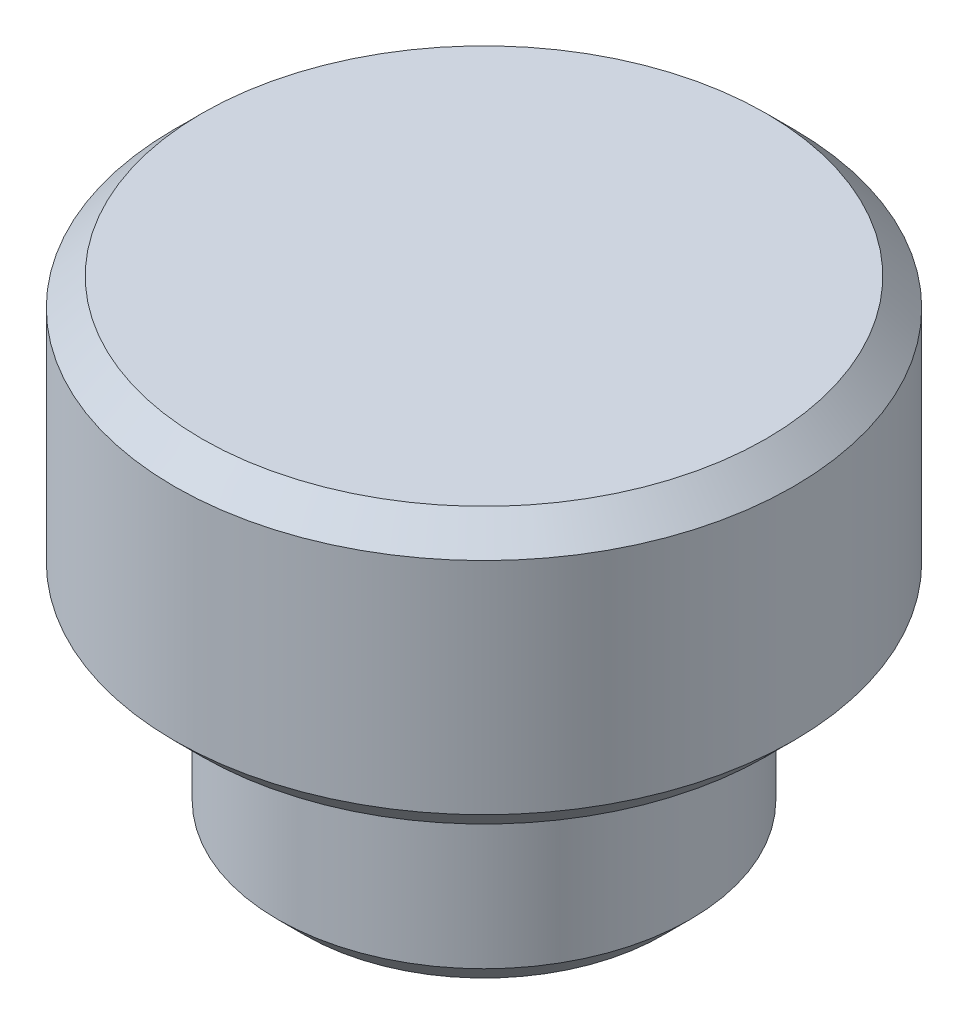
ISO-10303-21;
HEADER;
FILE_DESCRIPTION(('STEP AP214'),'2;1');
FILE_NAME('part.step','',(''),(''),'','','');
FILE_SCHEMA(('AUTOMOTIVE_DESIGN { 1 0 10303 214 1 1 1 1 }'));
ENDSEC;
DATA;
#1=APPLICATION_CONTEXT('core data for automotive mechanical design processes');
#2=APPLICATION_PROTOCOL_DEFINITION('international standard','automotive_design',2000,#1);
#3=PRODUCT_CONTEXT('',#1,'mechanical');
#4=PRODUCT('Part','Part','',(#3));
#5=PRODUCT_RELATED_PRODUCT_CATEGORY('part','',(#4));
#6=PRODUCT_DEFINITION_FORMATION('','',#4);
#7=PRODUCT_DEFINITION_CONTEXT('part definition',#1,'design');
#8=PRODUCT_DEFINITION('design','',#6,#7);
#9=PRODUCT_DEFINITION_SHAPE('','',#8);
#10=(LENGTH_UNIT() NAMED_UNIT(*) SI_UNIT(.MILLI.,.METRE.));
#11=(NAMED_UNIT(*) PLANE_ANGLE_UNIT() SI_UNIT($,.RADIAN.));
#12=(NAMED_UNIT(*) SI_UNIT($,.STERADIAN.) SOLID_ANGLE_UNIT());
#13=UNCERTAINTY_MEASURE_WITH_UNIT(LENGTH_MEASURE(1.E-05),#10,'distance_accuracy_value','');
#14=(GEOMETRIC_REPRESENTATION_CONTEXT(3) GLOBAL_UNCERTAINTY_ASSIGNED_CONTEXT((#13)) GLOBAL_UNIT_ASSIGNED_CONTEXT((#10,
#11,#12)) REPRESENTATION_CONTEXT('',''));
#15=CARTESIAN_POINT('',(0.,0.,0.));
#16=DIRECTION('',(0.,0.,1.));
#17=DIRECTION('',(1.,0.,0.));
#18=AXIS2_PLACEMENT_3D('',#15,#16,#17);
#19=CARTESIAN_POINT('',(0.,3.,0.));
#20=DIRECTION('',(0.,-1.,0.));
#21=DIRECTION('',(0.,0.,-1.));
#22=AXIS2_PLACEMENT_3D('',#19,#20,#21);
#23=CYLINDRICAL_SURFACE('',#22,3.);
#24=CARTESIAN_POINT('',(0.,2.6,0.));
#25=DIRECTION('',(0.,1.,0.));
#26=DIRECTION('',(0.,0.,1.));
#27=AXIS2_PLACEMENT_3D('',#24,#25,#26);
#28=CIRCLE('',#27,3.);
#29=CARTESIAN_POINT('',(0.,2.6,3.));
#30=VERTEX_POINT('',#29);
#31=EDGE_CURVE('E47',#30,#30,#28,.F.);
#32=ORIENTED_EDGE('',*,*,#31,.T.);
#33=EDGE_LOOP('',(#32));
#34=FACE_BOUND('',#33,.T.);
#35=CARTESIAN_POINT('',(0.,0.399999999999998,0.));
#36=DIRECTION('',(0.,1.,0.));
#37=DIRECTION('',(0.,0.,1.));
#38=AXIS2_PLACEMENT_3D('',#35,#36,#37);
#39=CIRCLE('',#38,3.);
#40=CARTESIAN_POINT('',(0.,0.399999999999998,3.));
#41=VERTEX_POINT('',#40);
#42=EDGE_CURVE('E51',#41,#41,#39,.T.);
#43=ORIENTED_EDGE('',*,*,#42,.T.);
#44=EDGE_LOOP('',(#43));
#45=FACE_BOUND('',#44,.T.);
#46=ADVANCED_FACE('F35',(#34,#45),#23,.T.);
#47=CARTESIAN_POINT('',(0.,0.,0.));
#48=DIRECTION('',(0.,1.,0.));
#49=DIRECTION('',(0.,0.,1.));
#50=AXIS2_PLACEMENT_3D('',#47,#48,#49);
#51=PLANE('',#50);
#52=CARTESIAN_POINT('',(0.,0.,0.));
#53=DIRECTION('',(0.,1.,0.));
#54=DIRECTION('',(0.,0.,1.));
#55=AXIS2_PLACEMENT_3D('',#52,#53,#54);
#56=CIRCLE('',#55,2.6);
#57=CARTESIAN_POINT('',(0.,0.,2.6));
#58=VERTEX_POINT('',#57);
#59=EDGE_CURVE('E43',#58,#58,#56,.F.);
#60=ORIENTED_EDGE('',*,*,#59,.T.);
#61=EDGE_LOOP('',(#60));
#62=FACE_BOUND('',#61,.T.);
#63=ADVANCED_FACE('F80',(#62),#51,.F.);
#64=CARTESIAN_POINT('',(0.,7.,0.));
#65=DIRECTION('',(0.,-1.,0.));
#66=DIRECTION('',(0.,0.,-1.));
#67=AXIS2_PLACEMENT_3D('',#64,#65,#66);
#68=CYLINDRICAL_SURFACE('',#67,4.5);
#69=CARTESIAN_POINT('',(0.,3.4,0.));
#70=DIRECTION('',(0.,1.,0.));
#71=DIRECTION('',(0.,0.,1.));
#72=AXIS2_PLACEMENT_3D('',#69,#70,#71);
#73=CIRCLE('',#72,4.5);
#74=CARTESIAN_POINT('',(0.,3.4,4.5));
#75=VERTEX_POINT('',#74);
#76=EDGE_CURVE('E62',#75,#75,#73,.T.);
#77=ORIENTED_EDGE('',*,*,#76,.T.);
#78=EDGE_LOOP('',(#77));
#79=FACE_BOUND('',#78,.T.);
#80=CARTESIAN_POINT('',(0.,6.6,0.));
#81=DIRECTION('',(0.,1.,0.));
#82=DIRECTION('',(0.,0.,1.));
#83=AXIS2_PLACEMENT_3D('',#80,#81,#82);
#84=CIRCLE('',#83,4.5);
#85=CARTESIAN_POINT('',(0.,6.6,4.5));
#86=VERTEX_POINT('',#85);
#87=EDGE_CURVE('E65',#86,#86,#84,.F.);
#88=ORIENTED_EDGE('',*,*,#87,.T.);
#89=EDGE_LOOP('',(#88));
#90=FACE_BOUND('',#89,.T.);
#91=ADVANCED_FACE('F69',(#79,#90),#68,.T.);
#92=CARTESIAN_POINT('',(0.,7.,0.));
#93=DIRECTION('',(0.,1.,0.));
#94=DIRECTION('',(0.,0.,1.));
#95=AXIS2_PLACEMENT_3D('',#92,#93,#94);
#96=PLANE('',#95);
#97=CARTESIAN_POINT('',(0.,7.,0.));
#98=DIRECTION('',(0.,1.,0.));
#99=DIRECTION('',(0.,0.,1.));
#100=AXIS2_PLACEMENT_3D('',#97,#98,#99);
#101=CIRCLE('',#100,4.1);
#102=CARTESIAN_POINT('',(0.,7.,4.1));
#103=VERTEX_POINT('',#102);
#104=EDGE_CURVE('E10',#103,#103,#101,.T.);
#105=ORIENTED_EDGE('',*,*,#104,.T.);
#106=EDGE_LOOP('',(#105));
#107=FACE_BOUND('',#106,.T.);
#108=ADVANCED_FACE('F115',(#107),#96,.T.);
#109=CARTESIAN_POINT('',(0.,3.,0.));
#110=DIRECTION('',(0.,1.,0.));
#111=DIRECTION('',(0.,0.,1.));
#112=AXIS2_PLACEMENT_3D('',#109,#110,#111);
#113=PLANE('',#112);
#114=CARTESIAN_POINT('',(0.,3.,0.));
#115=DIRECTION('',(0.,1.,0.));
#116=DIRECTION('',(0.,0.,1.));
#117=AXIS2_PLACEMENT_3D('',#114,#115,#116);
#118=CIRCLE('',#117,4.1);
#119=CARTESIAN_POINT('',(0.,3.,4.1));
#120=VERTEX_POINT('',#119);
#121=EDGE_CURVE('E56',#120,#120,#118,.F.);
#122=ORIENTED_EDGE('',*,*,#121,.T.);
#123=EDGE_LOOP('',(#122));
#124=FACE_BOUND('',#123,.T.);
#125=CARTESIAN_POINT('',(0.,3.,0.));
#126=DIRECTION('',(0.,1.,0.));
#127=DIRECTION('',(0.,0.,1.));
#128=AXIS2_PLACEMENT_3D('',#125,#126,#127);
#129=CIRCLE('',#128,3.4);
#130=CARTESIAN_POINT('',(0.,3.,3.4));
#131=VERTEX_POINT('',#130);
#132=EDGE_CURVE('E59',#131,#131,#129,.T.);
#133=ORIENTED_EDGE('',*,*,#132,.T.);
#134=EDGE_LOOP('',(#133));
#135=FACE_BOUND('',#134,.T.);
#136=ADVANCED_FACE('F97',(#124,#135),#113,.F.);
#137=CARTESIAN_POINT('',(0.,3.4,0.));
#138=DIRECTION('',(0.,1.,0.));
#139=DIRECTION('',(0.,0.,1.));
#140=AXIS2_PLACEMENT_3D('',#137,#138,#139);
#141=CONICAL_SURFACE('',#140,4.5,0.785398163397449);
#142=CARTESIAN_POINT('',(0.,3.,4.1));
#143=CARTESIAN_POINT('',(0.,3.00416666666667,4.10416666666667));
#144=CARTESIAN_POINT('',(0.,3.00833333333333,4.10833333333333));
#145=CARTESIAN_POINT('',(0.,3.01666666666667,4.11666666666667));
#146=CARTESIAN_POINT('',(0.,3.02083333333333,4.12083333333333));
#147=CARTESIAN_POINT('',(0.,3.02916666666667,4.12916666666667));
#148=CARTESIAN_POINT('',(0.,3.03333333333333,4.13333333333333));
#149=CARTESIAN_POINT('',(0.,3.04166666666667,4.14166666666667));
#150=CARTESIAN_POINT('',(0.,3.04583333333333,4.14583333333333));
#151=CARTESIAN_POINT('',(0.,3.05416666666667,4.15416666666667));
#152=CARTESIAN_POINT('',(0.,3.05833333333333,4.15833333333333));
#153=CARTESIAN_POINT('',(0.,3.06666666666667,4.16666666666667));
#154=CARTESIAN_POINT('',(0.,3.07083333333333,4.17083333333333));
#155=CARTESIAN_POINT('',(0.,3.07916666666667,4.17916666666667));
#156=CARTESIAN_POINT('',(0.,3.08333333333333,4.18333333333333));
#157=CARTESIAN_POINT('',(0.,3.09166666666667,4.19166666666667));
#158=CARTESIAN_POINT('',(0.,3.09583333333333,4.19583333333333));
#159=CARTESIAN_POINT('',(0.,3.10416666666667,4.20416666666667));
#160=CARTESIAN_POINT('',(0.,3.10833333333333,4.20833333333333));
#161=CARTESIAN_POINT('',(0.,3.11666666666667,4.21666666666667));
#162=CARTESIAN_POINT('',(0.,3.12083333333333,4.22083333333333));
#163=CARTESIAN_POINT('',(0.,3.12916666666667,4.22916666666667));
#164=CARTESIAN_POINT('',(0.,3.13333333333333,4.23333333333333));
#165=CARTESIAN_POINT('',(0.,3.14166666666667,4.24166666666667));
#166=CARTESIAN_POINT('',(0.,3.14583333333333,4.24583333333333));
#167=CARTESIAN_POINT('',(0.,3.15416666666667,4.25416666666667));
#168=CARTESIAN_POINT('',(0.,3.15833333333333,4.25833333333333));
#169=CARTESIAN_POINT('',(0.,3.16666666666667,4.26666666666667));
#170=CARTESIAN_POINT('',(0.,3.17083333333333,4.27083333333333));
#171=CARTESIAN_POINT('',(0.,3.17916666666667,4.27916666666667));
#172=CARTESIAN_POINT('',(0.,3.18333333333333,4.28333333333333));
#173=CARTESIAN_POINT('',(0.,3.19166666666667,4.29166666666667));
#174=CARTESIAN_POINT('',(0.,3.19583333333333,4.29583333333333));
#175=CARTESIAN_POINT('',(0.,3.20416666666667,4.30416666666667));
#176=CARTESIAN_POINT('',(0.,3.20833333333333,4.30833333333333));
#177=CARTESIAN_POINT('',(0.,3.21666666666667,4.31666666666667));
#178=CARTESIAN_POINT('',(0.,3.22083333333333,4.32083333333333));
#179=CARTESIAN_POINT('',(0.,3.22916666666667,4.32916666666667));
#180=CARTESIAN_POINT('',(0.,3.23333333333333,4.33333333333333));
#181=CARTESIAN_POINT('',(0.,3.24166666666667,4.34166666666667));
#182=CARTESIAN_POINT('',(0.,3.24583333333333,4.34583333333333));
#183=CARTESIAN_POINT('',(0.,3.25416666666667,4.35416666666667));
#184=CARTESIAN_POINT('',(0.,3.25833333333333,4.35833333333333));
#185=CARTESIAN_POINT('',(0.,3.26666666666667,4.36666666666667));
#186=CARTESIAN_POINT('',(0.,3.27083333333333,4.37083333333333));
#187=CARTESIAN_POINT('',(0.,3.27916666666667,4.37916666666667));
#188=CARTESIAN_POINT('',(0.,3.28333333333333,4.38333333333333));
#189=CARTESIAN_POINT('',(0.,3.29166666666667,4.39166666666667));
#190=CARTESIAN_POINT('',(0.,3.29583333333333,4.39583333333333));
#191=CARTESIAN_POINT('',(0.,3.30416666666667,4.40416666666667));
#192=CARTESIAN_POINT('',(0.,3.30833333333333,4.40833333333333));
#193=CARTESIAN_POINT('',(0.,3.31666666666667,4.41666666666667));
#194=CARTESIAN_POINT('',(0.,3.32083333333333,4.42083333333333));
#195=CARTESIAN_POINT('',(0.,3.32916666666667,4.42916666666667));
#196=CARTESIAN_POINT('',(0.,3.33333333333333,4.43333333333333));
#197=CARTESIAN_POINT('',(0.,3.34166666666667,4.44166666666667));
#198=CARTESIAN_POINT('',(0.,3.34583333333333,4.44583333333333));
#199=CARTESIAN_POINT('',(0.,3.35416666666667,4.45416666666667));
#200=CARTESIAN_POINT('',(0.,3.35833333333333,4.45833333333333));
#201=CARTESIAN_POINT('',(0.,3.36666666666666,4.46666666666667));
#202=CARTESIAN_POINT('',(0.,3.37083333333333,4.47083333333333));
#203=CARTESIAN_POINT('',(0.,3.37916666666666,4.47916666666667));
#204=CARTESIAN_POINT('',(0.,3.38333333333333,4.48333333333333));
#205=CARTESIAN_POINT('',(0.,3.39166666666667,4.49166666666667));
#206=CARTESIAN_POINT('',(0.,3.39583333333333,4.49583333333333));
#207=CARTESIAN_POINT('',(0.,3.4,4.5));
#208=B_SPLINE_CURVE_WITH_KNOTS('',3,(#142,#143,#144,#145,#146,#147,#148,#149,#150,#151,#152,
#153,#154,#155,#156,#157,#158,#159,#160,#161,#162,#163,#164,#165,#166,#167,#168,#169,#170,#171,
#172,#173,#174,#175,#176,#177,#178,#179,#180,#181,#182,#183,#184,#185,#186,#187,#188,#189,#190,
#191,#192,#193,#194,#195,#196,#197,#198,#199,#200,#201,#202,#203,#204,#205,#206,#207),
.UNSPECIFIED.,.F.,.F.,(4,2,2,2,2,2,2,2,2,2,2,2,2,2,2,2,2,2,2,2,2,2,2,2,2,2,2,2,2,2,2,2,4),(0.,
0.0176776695296633,0.0353553390593275,0.0530330085889907,0.0707106781186546,0.0883883476483179,
0.106066017177982,0.123743686707646,0.141421356237309,0.159099025766973,0.176776695296636,
0.1944543648263,0.212132034355963,0.229809703885627,0.247487373415291,0.265165042944954,
0.282842712474618,0.300520382004282,0.318198051533946,0.335875721063609,0.353553390593273,
0.371231060122937,0.3889087296526,0.406586399182264,0.424264068711927,0.441941738241591,
0.459619407771254,0.477297077300918,0.494974746830581,0.512652416360245,0.530330085889909,
0.548007755419573,0.565685424949237),.UNSPECIFIED.);
#209=EDGE_CURVE('BSEAM91',#120,#75,#208,.T.);
#210=ORIENTED_EDGE('',*,*,#121,.F.);
#211=ORIENTED_EDGE('',*,*,#76,.F.);
#212=ORIENTED_EDGE('',*,*,#209,.T.);
#213=ORIENTED_EDGE('',*,*,#209,.F.);
#214=EDGE_LOOP('',(#210,#212,#211,#213));
#215=FACE_BOUND('',#214,.T.);
#216=ADVANCED_FACE('F91',(#215),#141,.T.);
#217=CARTESIAN_POINT('',(0.,3.,0.));
#218=DIRECTION('',(0.,1.,0.));
#219=DIRECTION('',(0.,0.,1.));
#220=AXIS2_PLACEMENT_3D('',#217,#218,#219);
#221=CONICAL_SURFACE('',#220,3.4,0.785398163397454);
#222=ORIENTED_EDGE('',*,*,#31,.F.);
#223=EDGE_LOOP('',(#222));
#224=FACE_BOUND('',#223,.T.);
#225=ORIENTED_EDGE('',*,*,#132,.F.);
#226=EDGE_LOOP('',(#225));
#227=FACE_BOUND('',#226,.T.);
#228=ADVANCED_FACE('F77',(#224,#227),#221,.T.);
#229=CARTESIAN_POINT('',(0.,0.399999999999998,0.));
#230=DIRECTION('',(0.,1.,0.));
#231=DIRECTION('',(0.,0.,1.));
#232=AXIS2_PLACEMENT_3D('',#229,#230,#231);
#233=CONICAL_SURFACE('',#232,3.,0.785398163397451);
#234=ORIENTED_EDGE('',*,*,#59,.F.);
#235=EDGE_LOOP('',(#234));
#236=FACE_BOUND('',#235,.T.);
#237=ORIENTED_EDGE('',*,*,#42,.F.);
#238=EDGE_LOOP('',(#237));
#239=FACE_BOUND('',#238,.T.);
#240=ADVANCED_FACE('F73',(#236,#239),#233,.T.);
#241=CARTESIAN_POINT('',(0.,7.,0.));
#242=DIRECTION('',(0.,-1.,0.));
#243=DIRECTION('',(0.,0.,-1.));
#244=AXIS2_PLACEMENT_3D('',#241,#242,#243);
#245=CONICAL_SURFACE('',#244,4.1,0.785398163397444);
#246=ORIENTED_EDGE('',*,*,#87,.F.);
#247=EDGE_LOOP('',(#246));
#248=FACE_BOUND('',#247,.T.);
#249=ORIENTED_EDGE('',*,*,#104,.F.);
#250=EDGE_LOOP('',(#249));
#251=FACE_BOUND('',#250,.T.);
#252=ADVANCED_FACE('F38',(#248,#251),#245,.T.);
#253=CLOSED_SHELL('',(#46,#63,#91,#108,#136,#216,#228,#240,#252));
#254=MANIFOLD_SOLID_BREP('B2',#253);
#255=ADVANCED_BREP_SHAPE_REPRESENTATION('',(#18,#254),#14);
#256=SHAPE_DEFINITION_REPRESENTATION(#9,#255);
ENDSEC;
END-ISO-10303-21;
